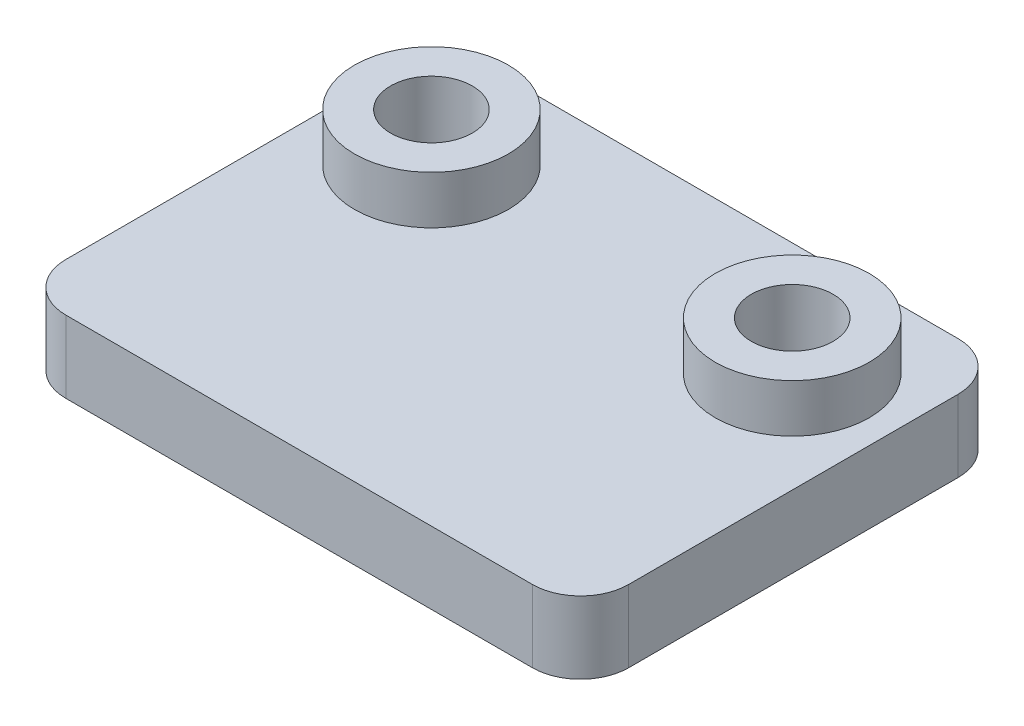
ISO-10303-21;
HEADER;
FILE_DESCRIPTION(('STEP AP214'),'2;1');
FILE_NAME('part.step','',(''),(''),'','','');
FILE_SCHEMA(('AUTOMOTIVE_DESIGN { 1 0 10303 214 1 1 1 1 }'));
ENDSEC;
DATA;
#1=APPLICATION_CONTEXT('core data for automotive mechanical design processes');
#2=APPLICATION_PROTOCOL_DEFINITION('international standard','automotive_design',2000,#1);
#3=PRODUCT_CONTEXT('',#1,'mechanical');
#4=PRODUCT('Part','Part','',(#3));
#5=PRODUCT_RELATED_PRODUCT_CATEGORY('part','',(#4));
#6=PRODUCT_DEFINITION_FORMATION('','',#4);
#7=PRODUCT_DEFINITION_CONTEXT('part definition',#1,'design');
#8=PRODUCT_DEFINITION('design','',#6,#7);
#9=PRODUCT_DEFINITION_SHAPE('','',#8);
#10=(LENGTH_UNIT() NAMED_UNIT(*) SI_UNIT(.MILLI.,.METRE.));
#11=(NAMED_UNIT(*) PLANE_ANGLE_UNIT() SI_UNIT($,.RADIAN.));
#12=(NAMED_UNIT(*) SI_UNIT($,.STERADIAN.) SOLID_ANGLE_UNIT());
#13=UNCERTAINTY_MEASURE_WITH_UNIT(LENGTH_MEASURE(1.E-05),#10,'distance_accuracy_value','');
#14=(GEOMETRIC_REPRESENTATION_CONTEXT(3) GLOBAL_UNCERTAINTY_ASSIGNED_CONTEXT((#13)) GLOBAL_UNIT_ASSIGNED_CONTEXT((#10,
#11,#12)) REPRESENTATION_CONTEXT('',''));
#15=CARTESIAN_POINT('',(0.,0.,0.));
#16=DIRECTION('',(0.,0.,1.));
#17=DIRECTION('',(1.,0.,0.));
#18=AXIS2_PLACEMENT_3D('',#15,#16,#17);
#19=CARTESIAN_POINT('',(0.,3.,0.));
#20=DIRECTION('',(0.,1.,0.));
#21=DIRECTION('',(0.,0.,1.));
#22=AXIS2_PLACEMENT_3D('',#19,#20,#21);
#23=PLANE('',#22);
#24=CARTESIAN_POINT('',(-7.5,3.,0.));
#25=DIRECTION('',(0.,1.,0.));
#26=DIRECTION('',(0.,0.,1.));
#27=AXIS2_PLACEMENT_3D('',#24,#25,#26);
#28=CIRCLE('',#27,3.2);
#29=CARTESIAN_POINT('',(-7.5,3.,3.2));
#30=VERTEX_POINT('',#29);
#31=EDGE_CURVE('E188',#30,#30,#28,.T.);
#32=ORIENTED_EDGE('',*,*,#31,.F.);
#33=EDGE_LOOP('',(#32));
#34=FACE_BOUND('',#33,.T.);
#35=DIRECTION('',(1.,0.,0.));
#36=VECTOR('',#35,1.);
#37=CARTESIAN_POINT('',(-11.7,3.,13.));
#38=LINE('',#37,#36);
#39=CARTESIAN_POINT('',(-9.69999999999999,3.,13.));
#40=VERTEX_POINT('',#39);
#41=CARTESIAN_POINT('',(9.7,3.,13.));
#42=VERTEX_POINT('',#41);
#43=EDGE_CURVE('E171',#40,#42,#38,.T.);
#44=ORIENTED_EDGE('',*,*,#43,.T.);
#45=CARTESIAN_POINT('',(9.7,3.,11.));
#46=DIRECTION('',(0.,1.,0.));
#47=DIRECTION('',(0.,0.,1.));
#48=AXIS2_PLACEMENT_3D('',#45,#46,#47);
#49=CIRCLE('',#48,2.);
#50=CARTESIAN_POINT('',(11.7,3.,11.));
#51=VERTEX_POINT('',#50);
#52=EDGE_CURVE('E149',#42,#51,#49,.T.);
#53=ORIENTED_EDGE('',*,*,#52,.T.);
#54=DIRECTION('',(0.,0.,-1.));
#55=VECTOR('',#54,1.);
#56=CARTESIAN_POINT('',(11.7,3.,-4.7));
#57=LINE('',#56,#55);
#58=CARTESIAN_POINT('',(11.7,3.,-2.7));
#59=VERTEX_POINT('',#58);
#60=EDGE_CURVE('E119',#51,#59,#57,.T.);
#61=ORIENTED_EDGE('',*,*,#60,.T.);
#62=CARTESIAN_POINT('',(9.7,3.,-2.7));
#63=DIRECTION('',(0.,1.,0.));
#64=DIRECTION('',(0.,0.,1.));
#65=AXIS2_PLACEMENT_3D('',#62,#63,#64);
#66=CIRCLE('',#65,2.);
#67=CARTESIAN_POINT('',(9.7,3.,-4.7));
#68=VERTEX_POINT('',#67);
#69=EDGE_CURVE('E55',#59,#68,#66,.T.);
#70=ORIENTED_EDGE('',*,*,#69,.T.);
#71=DIRECTION('',(-1.,0.,0.));
#72=VECTOR('',#71,1.);
#73=CARTESIAN_POINT('',(-11.7,3.,-4.7));
#74=LINE('',#73,#72);
#75=CARTESIAN_POINT('',(-9.7,3.,-4.7));
#76=VERTEX_POINT('',#75);
#77=EDGE_CURVE('E135',#68,#76,#74,.T.);
#78=ORIENTED_EDGE('',*,*,#77,.T.);
#79=CARTESIAN_POINT('',(-9.7,3.,-2.7));
#80=DIRECTION('',(0.,1.,0.));
#81=DIRECTION('',(0.,0.,1.));
#82=AXIS2_PLACEMENT_3D('',#79,#80,#81);
#83=CIRCLE('',#82,2.);
#84=CARTESIAN_POINT('',(-11.7,3.,-2.7));
#85=VERTEX_POINT('',#84);
#86=EDGE_CURVE('E145',#76,#85,#83,.T.);
#87=ORIENTED_EDGE('',*,*,#86,.T.);
#88=DIRECTION('',(0.,0.,1.));
#89=VECTOR('',#88,1.);
#90=CARTESIAN_POINT('',(-11.7,3.,-4.7));
#91=LINE('',#90,#89);
#92=CARTESIAN_POINT('',(-11.7,3.,11.));
#93=VERTEX_POINT('',#92);
#94=EDGE_CURVE('E129',#85,#93,#91,.T.);
#95=ORIENTED_EDGE('',*,*,#94,.T.);
#96=CARTESIAN_POINT('',(-9.69999999999999,3.,11.));
#97=DIRECTION('',(0.,1.,0.));
#98=DIRECTION('',(0.,0.,1.));
#99=AXIS2_PLACEMENT_3D('',#96,#97,#98);
#100=CIRCLE('',#99,2.);
#101=EDGE_CURVE('E147',#93,#40,#100,.T.);
#102=ORIENTED_EDGE('',*,*,#101,.T.);
#103=EDGE_LOOP('',(#44,#53,#61,#70,#78,#87,#95,#102));
#104=FACE_BOUND('',#103,.T.);
#105=CARTESIAN_POINT('',(7.5,3.,0.));
#106=DIRECTION('',(0.,1.,0.));
#107=DIRECTION('',(0.,0.,1.));
#108=AXIS2_PLACEMENT_3D('',#105,#106,#107);
#109=CIRCLE('',#108,3.2);
#110=CARTESIAN_POINT('',(7.5,3.,3.2));
#111=VERTEX_POINT('',#110);
#112=EDGE_CURVE('E197',#111,#111,#109,.T.);
#113=ORIENTED_EDGE('',*,*,#112,.F.);
#114=EDGE_LOOP('',(#113));
#115=FACE_BOUND('',#114,.T.);
#116=ADVANCED_FACE('F35',(#34,#104,#115),#23,.T.);
#117=CARTESIAN_POINT('',(0.,0.,0.));
#118=DIRECTION('',(0.,1.,0.));
#119=DIRECTION('',(0.,0.,1.));
#120=AXIS2_PLACEMENT_3D('',#117,#118,#119);
#121=PLANE('',#120);
#122=DIRECTION('',(0.,0.,-1.));
#123=VECTOR('',#122,1.);
#124=CARTESIAN_POINT('',(11.7,0.,-4.7));
#125=LINE('',#124,#123);
#126=CARTESIAN_POINT('',(11.7,0.,11.));
#127=VERTEX_POINT('',#126);
#128=CARTESIAN_POINT('',(11.7,0.,-2.7));
#129=VERTEX_POINT('',#128);
#130=EDGE_CURVE('E117',#127,#129,#125,.T.);
#131=ORIENTED_EDGE('',*,*,#130,.F.);
#132=CARTESIAN_POINT('',(9.7,0.,11.));
#133=DIRECTION('',(0.,1.,0.));
#134=DIRECTION('',(0.,0.,1.));
#135=AXIS2_PLACEMENT_3D('',#132,#133,#134);
#136=CIRCLE('',#135,2.);
#137=CARTESIAN_POINT('',(9.7,0.,13.));
#138=VERTEX_POINT('',#137);
#139=EDGE_CURVE('E100',#127,#138,#136,.F.);
#140=ORIENTED_EDGE('',*,*,#139,.T.);
#141=DIRECTION('',(1.,0.,0.));
#142=VECTOR('',#141,1.);
#143=CARTESIAN_POINT('',(-11.7,0.,13.));
#144=LINE('',#143,#142);
#145=CARTESIAN_POINT('',(-9.69999999999999,0.,13.));
#146=VERTEX_POINT('',#145);
#147=EDGE_CURVE('E127',#146,#138,#144,.T.);
#148=ORIENTED_EDGE('',*,*,#147,.F.);
#149=CARTESIAN_POINT('',(-9.69999999999999,0.,11.));
#150=DIRECTION('',(0.,1.,0.));
#151=DIRECTION('',(0.,0.,1.));
#152=AXIS2_PLACEMENT_3D('',#149,#150,#151);
#153=CIRCLE('',#152,2.);
#154=CARTESIAN_POINT('',(-11.7,0.,11.));
#155=VERTEX_POINT('',#154);
#156=EDGE_CURVE('E111',#146,#155,#153,.F.);
#157=ORIENTED_EDGE('',*,*,#156,.T.);
#158=DIRECTION('',(0.,0.,1.));
#159=VECTOR('',#158,1.);
#160=CARTESIAN_POINT('',(-11.7,0.,-4.7));
#161=LINE('',#160,#159);
#162=CARTESIAN_POINT('',(-11.7,0.,-2.7));
#163=VERTEX_POINT('',#162);
#164=EDGE_CURVE('E131',#163,#155,#161,.T.);
#165=ORIENTED_EDGE('',*,*,#164,.F.);
#166=CARTESIAN_POINT('',(-9.7,0.,-2.7));
#167=DIRECTION('',(0.,1.,0.));
#168=DIRECTION('',(0.,0.,1.));
#169=AXIS2_PLACEMENT_3D('',#166,#167,#168);
#170=CIRCLE('',#169,2.);
#171=CARTESIAN_POINT('',(-9.7,0.,-4.7));
#172=VERTEX_POINT('',#171);
#173=EDGE_CURVE('E138',#163,#172,#170,.F.);
#174=ORIENTED_EDGE('',*,*,#173,.T.);
#175=DIRECTION('',(-1.,0.,0.));
#176=VECTOR('',#175,1.);
#177=CARTESIAN_POINT('',(-11.7,0.,-4.7));
#178=LINE('',#177,#176);
#179=CARTESIAN_POINT('',(9.7,0.,-4.7));
#180=VERTEX_POINT('',#179);
#181=EDGE_CURVE('E126',#180,#172,#178,.T.);
#182=ORIENTED_EDGE('',*,*,#181,.F.);
#183=CARTESIAN_POINT('',(9.7,0.,-2.7));
#184=DIRECTION('',(0.,1.,0.));
#185=DIRECTION('',(0.,0.,1.));
#186=AXIS2_PLACEMENT_3D('',#183,#184,#185);
#187=CIRCLE('',#186,2.);
#188=EDGE_CURVE('E120',#180,#129,#187,.F.);
#189=ORIENTED_EDGE('',*,*,#188,.T.);
#190=EDGE_LOOP('',(#131,#140,#148,#157,#165,#174,#182,#189));
#191=FACE_BOUND('',#190,.T.);
#192=CARTESIAN_POINT('',(-7.5,0.,0.));
#193=DIRECTION('',(0.,1.,0.));
#194=DIRECTION('',(0.,0.,1.));
#195=AXIS2_PLACEMENT_3D('',#192,#193,#194);
#196=CIRCLE('',#195,1.7);
#197=CARTESIAN_POINT('',(-7.5,0.,1.7));
#198=VERTEX_POINT('',#197);
#199=EDGE_CURVE('E176',#198,#198,#196,.T.);
#200=ORIENTED_EDGE('',*,*,#199,.T.);
#201=EDGE_LOOP('',(#200));
#202=FACE_BOUND('',#201,.T.);
#203=CARTESIAN_POINT('',(7.5,0.,0.));
#204=DIRECTION('',(0.,1.,0.));
#205=DIRECTION('',(0.,0.,-1.));
#206=AXIS2_PLACEMENT_3D('',#203,#204,#205);
#207=CIRCLE('',#206,1.7);
#208=CARTESIAN_POINT('',(7.5,0.,-1.7));
#209=VERTEX_POINT('',#208);
#210=EDGE_CURVE('E181',#209,#209,#207,.T.);
#211=ORIENTED_EDGE('',*,*,#210,.T.);
#212=EDGE_LOOP('',(#211));
#213=FACE_BOUND('',#212,.T.);
#214=ADVANCED_FACE('F123',(#191,#202,#213),#121,.F.);
#215=CARTESIAN_POINT('',(-11.7,3.,-4.7));
#216=DIRECTION('',(1.,0.,0.));
#217=DIRECTION('',(0.,0.,-1.));
#218=AXIS2_PLACEMENT_3D('',#215,#216,#217);
#219=PLANE('',#218);
#220=ORIENTED_EDGE('',*,*,#164,.T.);
#221=DIRECTION('',(0.,-1.,0.));
#222=VECTOR('',#221,1.);
#223=CARTESIAN_POINT('',(-11.7,3.,11.));
#224=LINE('',#223,#222);
#225=EDGE_CURVE('E154',#155,#93,#224,.F.);
#226=ORIENTED_EDGE('',*,*,#225,.T.);
#227=ORIENTED_EDGE('',*,*,#94,.F.);
#228=DIRECTION('',(0.,-1.,0.));
#229=VECTOR('',#228,1.);
#230=CARTESIAN_POINT('',(-11.7,3.,-2.7));
#231=LINE('',#230,#229);
#232=EDGE_CURVE('E151',#85,#163,#231,.T.);
#233=ORIENTED_EDGE('',*,*,#232,.T.);
#234=EDGE_LOOP('',(#220,#226,#227,#233));
#235=FACE_BOUND('',#234,.T.);
#236=ADVANCED_FACE('F167',(#235),#219,.F.);
#237=CARTESIAN_POINT('',(-11.7,3.,13.));
#238=DIRECTION('',(0.,0.,-1.));
#239=DIRECTION('',(-1.,0.,0.));
#240=AXIS2_PLACEMENT_3D('',#237,#238,#239);
#241=PLANE('',#240);
#242=ORIENTED_EDGE('',*,*,#147,.T.);
#243=DIRECTION('',(0.,-1.,0.));
#244=VECTOR('',#243,1.);
#245=CARTESIAN_POINT('',(9.7,3.,13.));
#246=LINE('',#245,#244);
#247=EDGE_CURVE('E105',#138,#42,#246,.F.);
#248=ORIENTED_EDGE('',*,*,#247,.T.);
#249=ORIENTED_EDGE('',*,*,#43,.F.);
#250=DIRECTION('',(0.,-1.,0.));
#251=VECTOR('',#250,1.);
#252=CARTESIAN_POINT('',(-9.69999999999999,3.,13.));
#253=LINE('',#252,#251);
#254=EDGE_CURVE('E110',#40,#146,#253,.T.);
#255=ORIENTED_EDGE('',*,*,#254,.T.);
#256=EDGE_LOOP('',(#242,#248,#249,#255));
#257=FACE_BOUND('',#256,.T.);
#258=ADVANCED_FACE('F240',(#257),#241,.F.);
#259=CARTESIAN_POINT('',(11.7,3.,-4.7));
#260=DIRECTION('',(-1.,0.,0.));
#261=DIRECTION('',(0.,0.,1.));
#262=AXIS2_PLACEMENT_3D('',#259,#260,#261);
#263=PLANE('',#262);
#264=ORIENTED_EDGE('',*,*,#60,.F.);
#265=DIRECTION('',(0.,-1.,0.));
#266=VECTOR('',#265,1.);
#267=CARTESIAN_POINT('',(11.7,3.,11.));
#268=LINE('',#267,#266);
#269=EDGE_CURVE('E104',#51,#127,#268,.T.);
#270=ORIENTED_EDGE('',*,*,#269,.T.);
#271=ORIENTED_EDGE('',*,*,#130,.T.);
#272=DIRECTION('',(0.,-1.,0.));
#273=VECTOR('',#272,1.);
#274=CARTESIAN_POINT('',(11.7,3.,-2.7));
#275=LINE('',#274,#273);
#276=EDGE_CURVE('E121',#129,#59,#275,.F.);
#277=ORIENTED_EDGE('',*,*,#276,.T.);
#278=EDGE_LOOP('',(#264,#270,#271,#277));
#279=FACE_BOUND('',#278,.T.);
#280=ADVANCED_FACE('F116',(#279),#263,.F.);
#281=CARTESIAN_POINT('',(-11.7,3.,-4.7));
#282=DIRECTION('',(0.,0.,1.));
#283=DIRECTION('',(1.,0.,0.));
#284=AXIS2_PLACEMENT_3D('',#281,#282,#283);
#285=PLANE('',#284);
#286=ORIENTED_EDGE('',*,*,#181,.T.);
#287=DIRECTION('',(0.,-1.,0.));
#288=VECTOR('',#287,1.);
#289=CARTESIAN_POINT('',(-9.7,3.,-4.7));
#290=LINE('',#289,#288);
#291=EDGE_CURVE('E11',#172,#76,#290,.F.);
#292=ORIENTED_EDGE('',*,*,#291,.T.);
#293=ORIENTED_EDGE('',*,*,#77,.F.);
#294=DIRECTION('',(0.,-1.,0.));
#295=VECTOR('',#294,1.);
#296=CARTESIAN_POINT('',(9.7,3.,-4.7));
#297=LINE('',#296,#295);
#298=EDGE_CURVE('E43',#68,#180,#297,.T.);
#299=ORIENTED_EDGE('',*,*,#298,.T.);
#300=EDGE_LOOP('',(#286,#292,#293,#299));
#301=FACE_BOUND('',#300,.T.);
#302=ADVANCED_FACE('F157',(#301),#285,.F.);
#303=CARTESIAN_POINT('',(-7.5,3.,0.));
#304=DIRECTION('',(0.,-1.,0.));
#305=DIRECTION('',(0.,0.,-1.));
#306=AXIS2_PLACEMENT_3D('',#303,#304,#305);
#307=CYLINDRICAL_SURFACE('',#306,1.7);
#308=ORIENTED_EDGE('',*,*,#199,.F.);
#309=EDGE_LOOP('',(#308));
#310=FACE_BOUND('',#309,.T.);
#311=CARTESIAN_POINT('',(-7.5,5.,0.));
#312=DIRECTION('',(0.,1.,0.));
#313=DIRECTION('',(0.,0.,1.));
#314=AXIS2_PLACEMENT_3D('',#311,#312,#313);
#315=CIRCLE('',#314,1.7);
#316=CARTESIAN_POINT('',(-7.5,5.,1.7));
#317=VERTEX_POINT('',#316);
#318=EDGE_CURVE('E192',#317,#317,#315,.T.);
#319=ORIENTED_EDGE('',*,*,#318,.T.);
#320=EDGE_LOOP('',(#319));
#321=FACE_BOUND('',#320,.T.);
#322=ADVANCED_FACE('F233',(#310,#321),#307,.F.);
#323=CARTESIAN_POINT('',(7.5,3.,0.));
#324=DIRECTION('',(0.,-1.,0.));
#325=DIRECTION('',(0.,0.,-1.));
#326=AXIS2_PLACEMENT_3D('',#323,#324,#325);
#327=CYLINDRICAL_SURFACE('',#326,1.7);
#328=ORIENTED_EDGE('',*,*,#210,.F.);
#329=EDGE_LOOP('',(#328));
#330=FACE_BOUND('',#329,.T.);
#331=CARTESIAN_POINT('',(7.5,5.,0.));
#332=DIRECTION('',(0.,1.,0.));
#333=DIRECTION('',(0.,0.,1.));
#334=AXIS2_PLACEMENT_3D('',#331,#332,#333);
#335=CIRCLE('',#334,1.7);
#336=CARTESIAN_POINT('',(7.5,5.,1.7));
#337=VERTEX_POINT('',#336);
#338=EDGE_CURVE('E200',#337,#337,#335,.T.);
#339=ORIENTED_EDGE('',*,*,#338,.T.);
#340=EDGE_LOOP('',(#339));
#341=FACE_BOUND('',#340,.T.);
#342=ADVANCED_FACE('F206',(#330,#341),#327,.F.);
#343=CARTESIAN_POINT('',(-7.5,5.,0.));
#344=DIRECTION('',(0.,1.,0.));
#345=DIRECTION('',(0.,0.,1.));
#346=AXIS2_PLACEMENT_3D('',#343,#344,#345);
#347=PLANE('',#346);
#348=CARTESIAN_POINT('',(-7.5,5.,0.));
#349=DIRECTION('',(0.,1.,0.));
#350=DIRECTION('',(0.,0.,1.));
#351=AXIS2_PLACEMENT_3D('',#348,#349,#350);
#352=CIRCLE('',#351,3.2);
#353=CARTESIAN_POINT('',(-7.5,5.,3.2));
#354=VERTEX_POINT('',#353);
#355=EDGE_CURVE('E184',#354,#354,#352,.T.);
#356=ORIENTED_EDGE('',*,*,#355,.T.);
#357=EDGE_LOOP('',(#356));
#358=FACE_BOUND('',#357,.T.);
#359=ORIENTED_EDGE('',*,*,#318,.F.);
#360=EDGE_LOOP('',(#359));
#361=FACE_BOUND('',#360,.T.);
#362=ADVANCED_FACE('F220',(#358,#361),#347,.T.);
#363=CARTESIAN_POINT('',(-7.5,5.,0.));
#364=DIRECTION('',(0.,-1.,0.));
#365=DIRECTION('',(0.,0.,-1.));
#366=AXIS2_PLACEMENT_3D('',#363,#364,#365);
#367=CYLINDRICAL_SURFACE('',#366,3.2);
#368=ORIENTED_EDGE('',*,*,#355,.F.);
#369=EDGE_LOOP('',(#368));
#370=FACE_BOUND('',#369,.T.);
#371=ORIENTED_EDGE('',*,*,#31,.T.);
#372=EDGE_LOOP('',(#371));
#373=FACE_BOUND('',#372,.T.);
#374=ADVANCED_FACE('F211',(#370,#373),#367,.T.);
#375=CARTESIAN_POINT('',(7.5,5.,0.));
#376=DIRECTION('',(0.,1.,0.));
#377=DIRECTION('',(0.,0.,1.));
#378=AXIS2_PLACEMENT_3D('',#375,#376,#377);
#379=PLANE('',#378);
#380=CARTESIAN_POINT('',(7.5,5.,0.));
#381=DIRECTION('',(0.,1.,0.));
#382=DIRECTION('',(0.,0.,1.));
#383=AXIS2_PLACEMENT_3D('',#380,#381,#382);
#384=CIRCLE('',#383,3.2);
#385=CARTESIAN_POINT('',(7.5,5.,3.2));
#386=VERTEX_POINT('',#385);
#387=EDGE_CURVE('E196',#386,#386,#384,.T.);
#388=ORIENTED_EDGE('',*,*,#387,.T.);
#389=EDGE_LOOP('',(#388));
#390=FACE_BOUND('',#389,.T.);
#391=ORIENTED_EDGE('',*,*,#338,.F.);
#392=EDGE_LOOP('',(#391));
#393=FACE_BOUND('',#392,.T.);
#394=ADVANCED_FACE('F208',(#390,#393),#379,.T.);
#395=CARTESIAN_POINT('',(7.5,5.,0.));
#396=DIRECTION('',(0.,-1.,0.));
#397=DIRECTION('',(0.,0.,-1.));
#398=AXIS2_PLACEMENT_3D('',#395,#396,#397);
#399=CYLINDRICAL_SURFACE('',#398,3.2);
#400=ORIENTED_EDGE('',*,*,#387,.F.);
#401=EDGE_LOOP('',(#400));
#402=FACE_BOUND('',#401,.T.);
#403=ORIENTED_EDGE('',*,*,#112,.T.);
#404=EDGE_LOOP('',(#403));
#405=FACE_BOUND('',#404,.T.);
#406=ADVANCED_FACE('F210',(#402,#405),#399,.T.);
#407=CARTESIAN_POINT('',(9.7,3.,11.));
#408=DIRECTION('',(0.,-1.,0.));
#409=DIRECTION('',(0.,0.,-1.));
#410=AXIS2_PLACEMENT_3D('',#407,#408,#409);
#411=CYLINDRICAL_SURFACE('',#410,2.);
#412=ORIENTED_EDGE('',*,*,#52,.F.);
#413=ORIENTED_EDGE('',*,*,#247,.F.);
#414=ORIENTED_EDGE('',*,*,#139,.F.);
#415=ORIENTED_EDGE('',*,*,#269,.F.);
#416=EDGE_LOOP('',(#412,#413,#414,#415));
#417=FACE_BOUND('',#416,.T.);
#418=ADVANCED_FACE('F103',(#417),#411,.T.);
#419=CARTESIAN_POINT('',(-9.69999999999999,3.,11.));
#420=DIRECTION('',(0.,-1.,0.));
#421=DIRECTION('',(0.,0.,-1.));
#422=AXIS2_PLACEMENT_3D('',#419,#420,#421);
#423=CYLINDRICAL_SURFACE('',#422,2.);
#424=ORIENTED_EDGE('',*,*,#101,.F.);
#425=ORIENTED_EDGE('',*,*,#225,.F.);
#426=ORIENTED_EDGE('',*,*,#156,.F.);
#427=ORIENTED_EDGE('',*,*,#254,.F.);
#428=EDGE_LOOP('',(#424,#425,#426,#427));
#429=FACE_BOUND('',#428,.T.);
#430=ADVANCED_FACE('F248',(#429),#423,.T.);
#431=CARTESIAN_POINT('',(-9.7,3.,-2.7));
#432=DIRECTION('',(0.,-1.,0.));
#433=DIRECTION('',(0.,0.,-1.));
#434=AXIS2_PLACEMENT_3D('',#431,#432,#433);
#435=CYLINDRICAL_SURFACE('',#434,2.);
#436=ORIENTED_EDGE('',*,*,#86,.F.);
#437=ORIENTED_EDGE('',*,*,#291,.F.);
#438=ORIENTED_EDGE('',*,*,#173,.F.);
#439=ORIENTED_EDGE('',*,*,#232,.F.);
#440=EDGE_LOOP('',(#436,#437,#438,#439));
#441=FACE_BOUND('',#440,.T.);
#442=ADVANCED_FACE('F164',(#441),#435,.T.);
#443=CARTESIAN_POINT('',(9.7,3.,-2.7));
#444=DIRECTION('',(0.,-1.,0.));
#445=DIRECTION('',(0.,0.,-1.));
#446=AXIS2_PLACEMENT_3D('',#443,#444,#445);
#447=CYLINDRICAL_SURFACE('',#446,2.);
#448=ORIENTED_EDGE('',*,*,#69,.F.);
#449=ORIENTED_EDGE('',*,*,#276,.F.);
#450=ORIENTED_EDGE('',*,*,#188,.F.);
#451=ORIENTED_EDGE('',*,*,#298,.F.);
#452=EDGE_LOOP('',(#448,#449,#450,#451));
#453=FACE_BOUND('',#452,.T.);
#454=ADVANCED_FACE('F37',(#453),#447,.T.);
#455=CLOSED_SHELL('',(#116,#214,#236,#258,#280,#302,#322,#342,#362,#374,#394,#406,#418,#430,
#442,#454));
#456=MANIFOLD_SOLID_BREP('B2',#455);
#457=ADVANCED_BREP_SHAPE_REPRESENTATION('',(#18,#456),#14);
#458=SHAPE_DEFINITION_REPRESENTATION(#9,#457);
ENDSEC;
END-ISO-10303-21;
